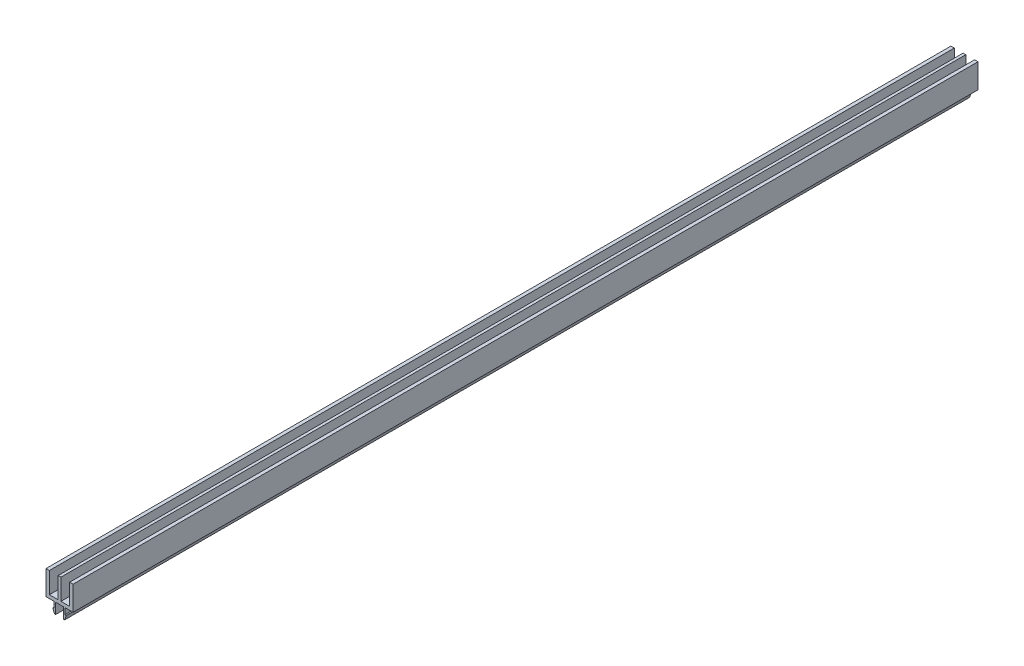
ISO-10303-21;
HEADER;
FILE_DESCRIPTION(('STEP AP214'),'2;1');
FILE_NAME('part.step','',(''),(''),'','','');
FILE_SCHEMA(('AUTOMOTIVE_DESIGN { 1 0 10303 214 1 1 1 1 }'));
ENDSEC;
DATA;
#1=APPLICATION_CONTEXT('core data for automotive mechanical design processes');
#2=APPLICATION_PROTOCOL_DEFINITION('international standard','automotive_design',2000,#1);
#3=PRODUCT_CONTEXT('',#1,'mechanical');
#4=PRODUCT('Part','Part','',(#3));
#5=PRODUCT_RELATED_PRODUCT_CATEGORY('part','',(#4));
#6=PRODUCT_DEFINITION_FORMATION('','',#4);
#7=PRODUCT_DEFINITION_CONTEXT('part definition',#1,'design');
#8=PRODUCT_DEFINITION('design','',#6,#7);
#9=PRODUCT_DEFINITION_SHAPE('','',#8);
#10=(LENGTH_UNIT() NAMED_UNIT(*) SI_UNIT(.MILLI.,.METRE.));
#11=(NAMED_UNIT(*) PLANE_ANGLE_UNIT() SI_UNIT($,.RADIAN.));
#12=(NAMED_UNIT(*) SI_UNIT($,.STERADIAN.) SOLID_ANGLE_UNIT());
#13=UNCERTAINTY_MEASURE_WITH_UNIT(LENGTH_MEASURE(1.E-05),#10,'distance_accuracy_value','');
#14=(GEOMETRIC_REPRESENTATION_CONTEXT(3) GLOBAL_UNCERTAINTY_ASSIGNED_CONTEXT((#13)) GLOBAL_UNIT_ASSIGNED_CONTEXT((#10,
#11,#12)) REPRESENTATION_CONTEXT('',''));
#15=CARTESIAN_POINT('',(0.,0.,0.));
#16=DIRECTION('',(0.,0.,1.));
#17=DIRECTION('',(1.,0.,0.));
#18=AXIS2_PLACEMENT_3D('',#15,#16,#17);
#19=CARTESIAN_POINT('',(-1.,17.9999999975,-618.));
#20=DIRECTION('',(-1.,0.,0.));
#21=DIRECTION('',(0.,-1.,0.));
#22=AXIS2_PLACEMENT_3D('',#19,#20,#21);
#23=PLANE('',#22);
#24=DIRECTION('',(0.,-1.,0.));
#25=VECTOR('',#24,1.);
#26=CARTESIAN_POINT('',(-1.,17.9999999975,50.));
#27=LINE('',#26,#25);
#28=CARTESIAN_POINT('',(-1.,17.9999999975,50.));
#29=VERTEX_POINT('',#28);
#30=CARTESIAN_POINT('',(-1.,2.4999999995,50.));
#31=VERTEX_POINT('',#30);
#32=EDGE_CURVE('E226',#29,#31,#27,.T.);
#33=ORIENTED_EDGE('',*,*,#32,.F.);
#34=DIRECTION('',(0.,0.,1.));
#35=VECTOR('',#34,1.);
#36=CARTESIAN_POINT('',(-1.,17.9999999975,-618.));
#37=LINE('',#36,#35);
#38=CARTESIAN_POINT('',(-1.,17.9999999975,-618.));
#39=VERTEX_POINT('',#38);
#40=EDGE_CURVE('E11',#39,#29,#37,.T.);
#41=ORIENTED_EDGE('',*,*,#40,.F.);
#42=DIRECTION('',(0.,-1.,0.));
#43=VECTOR('',#42,1.);
#44=CARTESIAN_POINT('',(-1.,17.9999999975,-618.));
#45=LINE('',#44,#43);
#46=CARTESIAN_POINT('',(-1.,2.4999999995,-618.));
#47=VERTEX_POINT('',#46);
#48=EDGE_CURVE('E294',#39,#47,#45,.T.);
#49=ORIENTED_EDGE('',*,*,#48,.T.);
#50=DIRECTION('',(0.,0.,1.));
#51=VECTOR('',#50,1.);
#52=CARTESIAN_POINT('',(-1.,2.4999999995,-618.));
#53=LINE('',#52,#51);
#54=EDGE_CURVE('E36',#47,#31,#53,.T.);
#55=ORIENTED_EDGE('',*,*,#54,.T.);
#56=EDGE_LOOP('',(#33,#41,#49,#55));
#57=FACE_BOUND('',#56,.T.);
#58=ADVANCED_FACE('F33',(#57),#23,.T.);
#59=CARTESIAN_POINT('',(0.999999999999998,17.9999999975,-618.));
#60=DIRECTION('',(0.,1.,0.));
#61=DIRECTION('',(0.,0.,1.));
#62=AXIS2_PLACEMENT_3D('',#59,#60,#61);
#63=PLANE('',#62);
#64=DIRECTION('',(-1.,0.,0.));
#65=VECTOR('',#64,1.);
#66=CARTESIAN_POINT('',(0.999999999999998,17.9999999975,50.));
#67=LINE('',#66,#65);
#68=CARTESIAN_POINT('',(0.999999999999998,17.9999999975,50.));
#69=VERTEX_POINT('',#68);
#70=EDGE_CURVE('E292',#69,#29,#67,.T.);
#71=ORIENTED_EDGE('',*,*,#70,.F.);
#72=DIRECTION('',(0.,0.,1.));
#73=VECTOR('',#72,1.);
#74=CARTESIAN_POINT('',(0.999999999999998,17.9999999975,-618.));
#75=LINE('',#74,#73);
#76=CARTESIAN_POINT('',(0.999999999999998,17.9999999975,-618.));
#77=VERTEX_POINT('',#76);
#78=EDGE_CURVE('E42',#77,#69,#75,.T.);
#79=ORIENTED_EDGE('',*,*,#78,.F.);
#80=DIRECTION('',(-1.,0.,0.));
#81=VECTOR('',#80,1.);
#82=CARTESIAN_POINT('',(0.999999999999998,17.9999999975,-618.));
#83=LINE('',#82,#81);
#84=EDGE_CURVE('E216',#77,#39,#83,.T.);
#85=ORIENTED_EDGE('',*,*,#84,.T.);
#86=ORIENTED_EDGE('',*,*,#40,.T.);
#87=EDGE_LOOP('',(#71,#79,#85,#86));
#88=FACE_BOUND('',#87,.T.);
#89=ADVANCED_FACE('F338',(#88),#63,.T.);
#90=CARTESIAN_POINT('',(0.999999999999998,2.4999999995,-618.));
#91=DIRECTION('',(1.,0.,0.));
#92=DIRECTION('',(0.,0.,-1.));
#93=AXIS2_PLACEMENT_3D('',#90,#91,#92);
#94=PLANE('',#93);
#95=DIRECTION('',(0.,1.,0.));
#96=VECTOR('',#95,1.);
#97=CARTESIAN_POINT('',(0.999999999999998,2.4999999995,50.));
#98=LINE('',#97,#96);
#99=CARTESIAN_POINT('',(0.999999999999998,2.4999999995,50.));
#100=VERTEX_POINT('',#99);
#101=EDGE_CURVE('E203',#100,#69,#98,.T.);
#102=ORIENTED_EDGE('',*,*,#101,.F.);
#103=DIRECTION('',(0.,0.,1.));
#104=VECTOR('',#103,1.);
#105=CARTESIAN_POINT('',(0.999999999999998,2.4999999995,-618.));
#106=LINE('',#105,#104);
#107=CARTESIAN_POINT('',(0.999999999999998,2.4999999995,-618.));
#108=VERTEX_POINT('',#107);
#109=EDGE_CURVE('E198',#108,#100,#106,.T.);
#110=ORIENTED_EDGE('',*,*,#109,.F.);
#111=DIRECTION('',(0.,1.,0.));
#112=VECTOR('',#111,1.);
#113=CARTESIAN_POINT('',(0.999999999999998,2.4999999995,-618.));
#114=LINE('',#113,#112);
#115=EDGE_CURVE('E201',#108,#77,#114,.T.);
#116=ORIENTED_EDGE('',*,*,#115,.T.);
#117=ORIENTED_EDGE('',*,*,#78,.T.);
#118=EDGE_LOOP('',(#102,#110,#116,#117));
#119=FACE_BOUND('',#118,.T.);
#120=ADVANCED_FACE('F200',(#119),#94,.T.);
#121=CARTESIAN_POINT('',(7.5,2.4999999995,-618.));
#122=DIRECTION('',(0.,1.,0.));
#123=DIRECTION('',(-1.,0.,0.));
#124=AXIS2_PLACEMENT_3D('',#121,#122,#123);
#125=PLANE('',#124);
#126=DIRECTION('',(-1.,0.,0.));
#127=VECTOR('',#126,1.);
#128=CARTESIAN_POINT('',(7.5,2.4999999995,50.));
#129=LINE('',#128,#127);
#130=CARTESIAN_POINT('',(7.5,2.4999999995,50.));
#131=VERTEX_POINT('',#130);
#132=EDGE_CURVE('E289',#131,#100,#129,.T.);
#133=ORIENTED_EDGE('',*,*,#132,.F.);
#134=DIRECTION('',(0.,0.,1.));
#135=VECTOR('',#134,1.);
#136=CARTESIAN_POINT('',(7.5,2.4999999995,-618.));
#137=LINE('',#136,#135);
#138=CARTESIAN_POINT('',(7.5,2.4999999995,-618.));
#139=VERTEX_POINT('',#138);
#140=EDGE_CURVE('E208',#139,#131,#137,.T.);
#141=ORIENTED_EDGE('',*,*,#140,.F.);
#142=DIRECTION('',(-1.,0.,0.));
#143=VECTOR('',#142,1.);
#144=CARTESIAN_POINT('',(7.5,2.4999999995,-618.));
#145=LINE('',#144,#143);
#146=EDGE_CURVE('E214',#139,#108,#145,.T.);
#147=ORIENTED_EDGE('',*,*,#146,.T.);
#148=ORIENTED_EDGE('',*,*,#109,.T.);
#149=EDGE_LOOP('',(#133,#141,#147,#148));
#150=FACE_BOUND('',#149,.T.);
#151=ADVANCED_FACE('F218',(#150),#125,.T.);
#152=CARTESIAN_POINT('',(7.5,17.9999999975,-618.));
#153=DIRECTION('',(-1.,0.,0.));
#154=DIRECTION('',(0.,-1.,0.));
#155=AXIS2_PLACEMENT_3D('',#152,#153,#154);
#156=PLANE('',#155);
#157=DIRECTION('',(0.,-1.,0.));
#158=VECTOR('',#157,1.);
#159=CARTESIAN_POINT('',(7.5,17.9999999975,50.));
#160=LINE('',#159,#158);
#161=CARTESIAN_POINT('',(7.5,17.9999999975,50.));
#162=VERTEX_POINT('',#161);
#163=EDGE_CURVE('E286',#162,#131,#160,.T.);
#164=ORIENTED_EDGE('',*,*,#163,.F.);
#165=DIRECTION('',(0.,0.,1.));
#166=VECTOR('',#165,1.);
#167=CARTESIAN_POINT('',(7.5,17.9999999975,-618.));
#168=LINE('',#167,#166);
#169=CARTESIAN_POINT('',(7.5,17.9999999975,-618.));
#170=VERTEX_POINT('',#169);
#171=EDGE_CURVE('E298',#170,#162,#168,.T.);
#172=ORIENTED_EDGE('',*,*,#171,.F.);
#173=DIRECTION('',(0.,-1.,0.));
#174=VECTOR('',#173,1.);
#175=CARTESIAN_POINT('',(7.5,17.9999999975,-618.));
#176=LINE('',#175,#174);
#177=EDGE_CURVE('E219',#170,#139,#176,.T.);
#178=ORIENTED_EDGE('',*,*,#177,.T.);
#179=ORIENTED_EDGE('',*,*,#140,.T.);
#180=EDGE_LOOP('',(#164,#172,#178,#179));
#181=FACE_BOUND('',#180,.T.);
#182=ADVANCED_FACE('F351',(#181),#156,.T.);
#183=CARTESIAN_POINT('',(10.,17.9999999975,-618.));
#184=DIRECTION('',(0.,1.,0.));
#185=DIRECTION('',(0.,0.,1.));
#186=AXIS2_PLACEMENT_3D('',#183,#184,#185);
#187=PLANE('',#186);
#188=DIRECTION('',(-1.,0.,0.));
#189=VECTOR('',#188,1.);
#190=CARTESIAN_POINT('',(10.,17.9999999975,50.));
#191=LINE('',#190,#189);
#192=CARTESIAN_POINT('',(10.,17.9999999975,50.));
#193=VERTEX_POINT('',#192);
#194=EDGE_CURVE('E283',#193,#162,#191,.T.);
#195=ORIENTED_EDGE('',*,*,#194,.F.);
#196=DIRECTION('',(0.,0.,1.));
#197=VECTOR('',#196,1.);
#198=CARTESIAN_POINT('',(10.,17.9999999975,-618.));
#199=LINE('',#198,#197);
#200=CARTESIAN_POINT('',(10.,17.9999999975,-618.));
#201=VERTEX_POINT('',#200);
#202=EDGE_CURVE('E300',#201,#193,#199,.T.);
#203=ORIENTED_EDGE('',*,*,#202,.F.);
#204=DIRECTION('',(-1.,0.,0.));
#205=VECTOR('',#204,1.);
#206=CARTESIAN_POINT('',(10.,17.9999999975,-618.));
#207=LINE('',#206,#205);
#208=EDGE_CURVE('E221',#201,#170,#207,.T.);
#209=ORIENTED_EDGE('',*,*,#208,.T.);
#210=ORIENTED_EDGE('',*,*,#171,.T.);
#211=EDGE_LOOP('',(#195,#203,#209,#210));
#212=FACE_BOUND('',#211,.T.);
#213=ADVANCED_FACE('F354',(#212),#187,.T.);
#214=CARTESIAN_POINT('',(10.,-4.99999828349541E-10,-618.));
#215=DIRECTION('',(1.,0.,0.));
#216=DIRECTION('',(0.,0.,-1.));
#217=AXIS2_PLACEMENT_3D('',#214,#215,#216);
#218=PLANE('',#217);
#219=DIRECTION('',(0.,1.,0.));
#220=VECTOR('',#219,1.);
#221=CARTESIAN_POINT('',(10.,-4.99999828349541E-10,50.));
#222=LINE('',#221,#220);
#223=CARTESIAN_POINT('',(10.,-4.99999828349541E-10,50.));
#224=VERTEX_POINT('',#223);
#225=EDGE_CURVE('E280',#224,#193,#222,.T.);
#226=ORIENTED_EDGE('',*,*,#225,.F.);
#227=DIRECTION('',(0.,0.,1.));
#228=VECTOR('',#227,1.);
#229=CARTESIAN_POINT('',(10.,-4.99999828349541E-10,-618.));
#230=LINE('',#229,#228);
#231=CARTESIAN_POINT('',(10.,-4.99999828349541E-10,-618.));
#232=VERTEX_POINT('',#231);
#233=EDGE_CURVE('E302',#232,#224,#230,.T.);
#234=ORIENTED_EDGE('',*,*,#233,.F.);
#235=DIRECTION('',(0.,1.,0.));
#236=VECTOR('',#235,1.);
#237=CARTESIAN_POINT('',(10.,-4.99999828349541E-10,-618.));
#238=LINE('',#237,#236);
#239=EDGE_CURVE('E644',#232,#201,#238,.T.);
#240=ORIENTED_EDGE('',*,*,#239,.T.);
#241=ORIENTED_EDGE('',*,*,#202,.T.);
#242=EDGE_LOOP('',(#226,#234,#240,#241));
#243=FACE_BOUND('',#242,.T.);
#244=ADVANCED_FACE('F358',(#243),#218,.T.);
#245=CARTESIAN_POINT('',(4.,-4.99999998002099E-10,-618.));
#246=DIRECTION('',(0.,-1.,0.));
#247=DIRECTION('',(1.,0.,0.));
#248=AXIS2_PLACEMENT_3D('',#245,#246,#247);
#249=PLANE('',#248);
#250=DIRECTION('',(1.,0.,0.));
#251=VECTOR('',#250,1.);
#252=CARTESIAN_POINT('',(4.,-4.99999998002099E-10,50.));
#253=LINE('',#252,#251);
#254=CARTESIAN_POINT('',(4.,-4.99999998002099E-10,50.));
#255=VERTEX_POINT('',#254);
#256=EDGE_CURVE('E277',#255,#224,#253,.T.);
#257=ORIENTED_EDGE('',*,*,#256,.F.);
#258=DIRECTION('',(0.,0.,1.));
#259=VECTOR('',#258,1.);
#260=CARTESIAN_POINT('',(4.,-4.99999998002099E-10,-618.));
#261=LINE('',#260,#259);
#262=CARTESIAN_POINT('',(4.,-4.99999998002099E-10,-618.));
#263=VERTEX_POINT('',#262);
#264=EDGE_CURVE('E304',#263,#255,#261,.T.);
#265=ORIENTED_EDGE('',*,*,#264,.F.);
#266=DIRECTION('',(1.,0.,0.));
#267=VECTOR('',#266,1.);
#268=CARTESIAN_POINT('',(4.,-4.99999998002099E-10,-618.));
#269=LINE('',#268,#267);
#270=EDGE_CURVE('E648',#263,#232,#269,.T.);
#271=ORIENTED_EDGE('',*,*,#270,.T.);
#272=ORIENTED_EDGE('',*,*,#233,.T.);
#273=EDGE_LOOP('',(#257,#265,#271,#272));
#274=FACE_BOUND('',#273,.T.);
#275=ADVANCED_FACE('F362',(#274),#249,.T.);
#276=CARTESIAN_POINT('',(4.,-4.5,-618.));
#277=DIRECTION('',(1.,0.,0.));
#278=DIRECTION('',(0.,0.,-1.));
#279=AXIS2_PLACEMENT_3D('',#276,#277,#278);
#280=PLANE('',#279);
#281=DIRECTION('',(0.,1.,0.));
#282=VECTOR('',#281,1.);
#283=CARTESIAN_POINT('',(4.,-4.5,50.));
#284=LINE('',#283,#282);
#285=CARTESIAN_POINT('',(4.,-4.5,50.));
#286=VERTEX_POINT('',#285);
#287=EDGE_CURVE('E274',#286,#255,#284,.T.);
#288=ORIENTED_EDGE('',*,*,#287,.F.);
#289=DIRECTION('',(0.,0.,1.));
#290=VECTOR('',#289,1.);
#291=CARTESIAN_POINT('',(4.,-4.5,-618.));
#292=LINE('',#291,#290);
#293=CARTESIAN_POINT('',(4.,-4.5,-618.));
#294=VERTEX_POINT('',#293);
#295=EDGE_CURVE('E306',#294,#286,#292,.T.);
#296=ORIENTED_EDGE('',*,*,#295,.F.);
#297=DIRECTION('',(0.,1.,0.));
#298=VECTOR('',#297,1.);
#299=CARTESIAN_POINT('',(4.,-4.5,-618.));
#300=LINE('',#299,#298);
#301=EDGE_CURVE('E637',#294,#263,#300,.T.);
#302=ORIENTED_EDGE('',*,*,#301,.T.);
#303=ORIENTED_EDGE('',*,*,#264,.T.);
#304=EDGE_LOOP('',(#288,#296,#302,#303));
#305=FACE_BOUND('',#304,.T.);
#306=ADVANCED_FACE('F366',(#305),#280,.T.);
#307=CARTESIAN_POINT('',(5.,-4.5,-618.));
#308=DIRECTION('',(0.,1.,0.));
#309=DIRECTION('',(0.,0.,1.));
#310=AXIS2_PLACEMENT_3D('',#307,#308,#309);
#311=PLANE('',#310);
#312=DIRECTION('',(-1.,0.,0.));
#313=VECTOR('',#312,1.);
#314=CARTESIAN_POINT('',(5.,-4.5,50.));
#315=LINE('',#314,#313);
#316=CARTESIAN_POINT('',(5.,-4.5,50.));
#317=VERTEX_POINT('',#316);
#318=EDGE_CURVE('E271',#317,#286,#315,.T.);
#319=ORIENTED_EDGE('',*,*,#318,.F.);
#320=DIRECTION('',(0.,0.,1.));
#321=VECTOR('',#320,1.);
#322=CARTESIAN_POINT('',(5.,-4.5,-618.));
#323=LINE('',#322,#321);
#324=CARTESIAN_POINT('',(5.,-4.5,-618.));
#325=VERTEX_POINT('',#324);
#326=EDGE_CURVE('E308',#325,#317,#323,.T.);
#327=ORIENTED_EDGE('',*,*,#326,.F.);
#328=DIRECTION('',(-1.,0.,0.));
#329=VECTOR('',#328,1.);
#330=CARTESIAN_POINT('',(5.,-4.5,-618.));
#331=LINE('',#330,#329);
#332=EDGE_CURVE('E633',#325,#294,#331,.T.);
#333=ORIENTED_EDGE('',*,*,#332,.T.);
#334=ORIENTED_EDGE('',*,*,#295,.T.);
#335=EDGE_LOOP('',(#319,#327,#333,#334));
#336=FACE_BOUND('',#335,.T.);
#337=ADVANCED_FACE('F370',(#336),#311,.T.);
#338=CARTESIAN_POINT('',(3.75,-8.,-618.));
#339=DIRECTION('',(0.941741911594837,-0.336336396998157,0.));
#340=DIRECTION('',(0.336336396998157,0.941741911594837,0.));
#341=AXIS2_PLACEMENT_3D('',#338,#339,#340);
#342=PLANE('',#341);
#343=DIRECTION('',(0.336336396998157,0.941741911594837,0.));
#344=VECTOR('',#343,1.);
#345=CARTESIAN_POINT('',(3.75,-8.,50.));
#346=LINE('',#345,#344);
#347=CARTESIAN_POINT('',(3.75,-8.,50.));
#348=VERTEX_POINT('',#347);
#349=EDGE_CURVE('E268',#348,#317,#346,.T.);
#350=ORIENTED_EDGE('',*,*,#349,.F.);
#351=DIRECTION('',(0.,0.,1.));
#352=VECTOR('',#351,1.);
#353=CARTESIAN_POINT('',(3.75,-8.,-618.));
#354=LINE('',#353,#352);
#355=CARTESIAN_POINT('',(3.75,-8.,-618.));
#356=VERTEX_POINT('',#355);
#357=EDGE_CURVE('E310',#356,#348,#354,.T.);
#358=ORIENTED_EDGE('',*,*,#357,.F.);
#359=DIRECTION('',(0.336336396998157,0.941741911594837,0.));
#360=VECTOR('',#359,1.);
#361=CARTESIAN_POINT('',(3.75,-8.,-618.));
#362=LINE('',#361,#360);
#363=EDGE_CURVE('E654',#356,#325,#362,.T.);
#364=ORIENTED_EDGE('',*,*,#363,.T.);
#365=ORIENTED_EDGE('',*,*,#326,.T.);
#366=EDGE_LOOP('',(#350,#358,#364,#365));
#367=FACE_BOUND('',#366,.T.);
#368=ADVANCED_FACE('F374',(#367),#342,.T.);
#369=CARTESIAN_POINT('',(3.,-8.,-618.));
#370=DIRECTION('',(0.,-1.,0.));
#371=DIRECTION('',(0.,0.,-1.));
#372=AXIS2_PLACEMENT_3D('',#369,#370,#371);
#373=PLANE('',#372);
#374=DIRECTION('',(1.,0.,0.));
#375=VECTOR('',#374,1.);
#376=CARTESIAN_POINT('',(3.,-8.,50.));
#377=LINE('',#376,#375);
#378=CARTESIAN_POINT('',(3.,-8.,50.));
#379=VERTEX_POINT('',#378);
#380=EDGE_CURVE('E265',#379,#348,#377,.T.);
#381=ORIENTED_EDGE('',*,*,#380,.F.);
#382=DIRECTION('',(0.,0.,1.));
#383=VECTOR('',#382,1.);
#384=CARTESIAN_POINT('',(3.,-8.,-618.));
#385=LINE('',#384,#383);
#386=CARTESIAN_POINT('',(3.,-8.,-618.));
#387=VERTEX_POINT('',#386);
#388=EDGE_CURVE('E312',#387,#379,#385,.T.);
#389=ORIENTED_EDGE('',*,*,#388,.F.);
#390=DIRECTION('',(1.,0.,0.));
#391=VECTOR('',#390,1.);
#392=CARTESIAN_POINT('',(3.,-8.,-618.));
#393=LINE('',#392,#391);
#394=EDGE_CURVE('E626',#387,#356,#393,.T.);
#395=ORIENTED_EDGE('',*,*,#394,.T.);
#396=ORIENTED_EDGE('',*,*,#357,.T.);
#397=EDGE_LOOP('',(#381,#389,#395,#396));
#398=FACE_BOUND('',#397,.T.);
#399=ADVANCED_FACE('F378',(#398),#373,.T.);
#400=CARTESIAN_POINT('',(3.,-4.9999985194348E-10,-618.));
#401=DIRECTION('',(-1.,0.,0.));
#402=DIRECTION('',(0.,0.,1.));
#403=AXIS2_PLACEMENT_3D('',#400,#401,#402);
#404=PLANE('',#403);
#405=DIRECTION('',(0.,-1.,0.));
#406=VECTOR('',#405,1.);
#407=CARTESIAN_POINT('',(3.,-4.9999985194348E-10,50.));
#408=LINE('',#407,#406);
#409=CARTESIAN_POINT('',(3.,-4.9999985194348E-10,50.));
#410=VERTEX_POINT('',#409);
#411=EDGE_CURVE('E262',#410,#379,#408,.T.);
#412=ORIENTED_EDGE('',*,*,#411,.F.);
#413=DIRECTION('',(0.,0.,1.));
#414=VECTOR('',#413,1.);
#415=CARTESIAN_POINT('',(3.,-4.9999985194348E-10,-618.));
#416=LINE('',#415,#414);
#417=CARTESIAN_POINT('',(3.,-4.9999985194348E-10,-618.));
#418=VERTEX_POINT('',#417);
#419=EDGE_CURVE('E314',#418,#410,#416,.T.);
#420=ORIENTED_EDGE('',*,*,#419,.F.);
#421=DIRECTION('',(0.,-1.,0.));
#422=VECTOR('',#421,1.);
#423=CARTESIAN_POINT('',(3.,-4.9999985194348E-10,-618.));
#424=LINE('',#423,#422);
#425=EDGE_CURVE('E622',#418,#387,#424,.T.);
#426=ORIENTED_EDGE('',*,*,#425,.T.);
#427=ORIENTED_EDGE('',*,*,#388,.T.);
#428=EDGE_LOOP('',(#412,#420,#426,#427));
#429=FACE_BOUND('',#428,.T.);
#430=ADVANCED_FACE('F382',(#429),#404,.T.);
#431=CARTESIAN_POINT('',(-3.,-4.99999455901012E-10,-618.));
#432=DIRECTION('',(0.,-1.,0.));
#433=DIRECTION('',(1.,0.,0.));
#434=AXIS2_PLACEMENT_3D('',#431,#432,#433);
#435=PLANE('',#434);
#436=DIRECTION('',(1.,0.,0.));
#437=VECTOR('',#436,1.);
#438=CARTESIAN_POINT('',(-3.,-4.99999455901012E-10,50.));
#439=LINE('',#438,#437);
#440=CARTESIAN_POINT('',(-3.,-4.99999455901012E-10,50.));
#441=VERTEX_POINT('',#440);
#442=EDGE_CURVE('E259',#441,#410,#439,.T.);
#443=ORIENTED_EDGE('',*,*,#442,.F.);
#444=DIRECTION('',(0.,0.,1.));
#445=VECTOR('',#444,1.);
#446=CARTESIAN_POINT('',(-3.,-4.99999455901012E-10,-618.));
#447=LINE('',#446,#445);
#448=CARTESIAN_POINT('',(-3.,-4.99999455901012E-10,-618.));
#449=VERTEX_POINT('',#448);
#450=EDGE_CURVE('E316',#449,#441,#447,.T.);
#451=ORIENTED_EDGE('',*,*,#450,.F.);
#452=DIRECTION('',(1.,0.,0.));
#453=VECTOR('',#452,1.);
#454=CARTESIAN_POINT('',(-3.,-4.99999455901012E-10,-618.));
#455=LINE('',#454,#453);
#456=EDGE_CURVE('E658',#449,#418,#455,.T.);
#457=ORIENTED_EDGE('',*,*,#456,.T.);
#458=ORIENTED_EDGE('',*,*,#419,.T.);
#459=EDGE_LOOP('',(#443,#451,#457,#458));
#460=FACE_BOUND('',#459,.T.);
#461=ADVANCED_FACE('F386',(#460),#435,.T.);
#462=CARTESIAN_POINT('',(-3.,-8.,-618.));
#463=DIRECTION('',(1.,0.,0.));
#464=DIRECTION('',(0.,0.,-1.));
#465=AXIS2_PLACEMENT_3D('',#462,#463,#464);
#466=PLANE('',#465);
#467=DIRECTION('',(0.,1.,0.));
#468=VECTOR('',#467,1.);
#469=CARTESIAN_POINT('',(-3.,-8.,50.));
#470=LINE('',#469,#468);
#471=CARTESIAN_POINT('',(-3.,-8.,50.));
#472=VERTEX_POINT('',#471);
#473=EDGE_CURVE('E256',#472,#441,#470,.T.);
#474=ORIENTED_EDGE('',*,*,#473,.F.);
#475=DIRECTION('',(0.,0.,1.));
#476=VECTOR('',#475,1.);
#477=CARTESIAN_POINT('',(-3.,-8.,-618.));
#478=LINE('',#477,#476);
#479=CARTESIAN_POINT('',(-3.,-8.,-618.));
#480=VERTEX_POINT('',#479);
#481=EDGE_CURVE('E318',#480,#472,#478,.T.);
#482=ORIENTED_EDGE('',*,*,#481,.F.);
#483=DIRECTION('',(0.,1.,0.));
#484=VECTOR('',#483,1.);
#485=CARTESIAN_POINT('',(-3.,-8.,-618.));
#486=LINE('',#485,#484);
#487=EDGE_CURVE('E615',#480,#449,#486,.T.);
#488=ORIENTED_EDGE('',*,*,#487,.T.);
#489=ORIENTED_EDGE('',*,*,#450,.T.);
#490=EDGE_LOOP('',(#474,#482,#488,#489));
#491=FACE_BOUND('',#490,.T.);
#492=ADVANCED_FACE('F390',(#491),#466,.T.);
#493=CARTESIAN_POINT('',(-3.75,-8.,-618.));
#494=DIRECTION('',(0.,-1.,0.));
#495=DIRECTION('',(0.,0.,-1.));
#496=AXIS2_PLACEMENT_3D('',#493,#494,#495);
#497=PLANE('',#496);
#498=DIRECTION('',(1.,0.,0.));
#499=VECTOR('',#498,1.);
#500=CARTESIAN_POINT('',(-3.75,-8.,50.));
#501=LINE('',#500,#499);
#502=CARTESIAN_POINT('',(-3.75,-8.,50.));
#503=VERTEX_POINT('',#502);
#504=EDGE_CURVE('E253',#503,#472,#501,.T.);
#505=ORIENTED_EDGE('',*,*,#504,.F.);
#506=DIRECTION('',(0.,0.,1.));
#507=VECTOR('',#506,1.);
#508=CARTESIAN_POINT('',(-3.75,-8.,-618.));
#509=LINE('',#508,#507);
#510=CARTESIAN_POINT('',(-3.75,-8.,-618.));
#511=VERTEX_POINT('',#510);
#512=EDGE_CURVE('E320',#511,#503,#509,.T.);
#513=ORIENTED_EDGE('',*,*,#512,.F.);
#514=DIRECTION('',(1.,0.,0.));
#515=VECTOR('',#514,1.);
#516=CARTESIAN_POINT('',(-3.75,-8.,-618.));
#517=LINE('',#516,#515);
#518=EDGE_CURVE('E611',#511,#480,#517,.T.);
#519=ORIENTED_EDGE('',*,*,#518,.T.);
#520=ORIENTED_EDGE('',*,*,#481,.T.);
#521=EDGE_LOOP('',(#505,#513,#519,#520));
#522=FACE_BOUND('',#521,.T.);
#523=ADVANCED_FACE('F394',(#522),#497,.T.);
#524=CARTESIAN_POINT('',(-5.,-4.5,-618.));
#525=DIRECTION('',(-0.941741911594837,-0.336336396998156,0.));
#526=DIRECTION('',(0.336336396998156,-0.941741911594837,0.));
#527=AXIS2_PLACEMENT_3D('',#524,#525,#526);
#528=PLANE('',#527);
#529=DIRECTION('',(0.336336396998156,-0.941741911594837,0.));
#530=VECTOR('',#529,1.);
#531=CARTESIAN_POINT('',(-5.,-4.5,50.));
#532=LINE('',#531,#530);
#533=CARTESIAN_POINT('',(-5.,-4.5,50.));
#534=VERTEX_POINT('',#533);
#535=EDGE_CURVE('E250',#534,#503,#532,.T.);
#536=ORIENTED_EDGE('',*,*,#535,.F.);
#537=DIRECTION('',(0.,0.,1.));
#538=VECTOR('',#537,1.);
#539=CARTESIAN_POINT('',(-5.,-4.5,-618.));
#540=LINE('',#539,#538);
#541=CARTESIAN_POINT('',(-5.,-4.5,-618.));
#542=VERTEX_POINT('',#541);
#543=EDGE_CURVE('E322',#542,#534,#540,.T.);
#544=ORIENTED_EDGE('',*,*,#543,.F.);
#545=DIRECTION('',(0.336336396998156,-0.941741911594837,0.));
#546=VECTOR('',#545,1.);
#547=CARTESIAN_POINT('',(-5.,-4.5,-618.));
#548=LINE('',#547,#546);
#549=EDGE_CURVE('E662',#542,#511,#548,.T.);
#550=ORIENTED_EDGE('',*,*,#549,.T.);
#551=ORIENTED_EDGE('',*,*,#512,.T.);
#552=EDGE_LOOP('',(#536,#544,#550,#551));
#553=FACE_BOUND('',#552,.T.);
#554=ADVANCED_FACE('F398',(#553),#528,.T.);
#555=CARTESIAN_POINT('',(-4.,-4.5,-618.));
#556=DIRECTION('',(0.,1.,0.));
#557=DIRECTION('',(0.,0.,1.));
#558=AXIS2_PLACEMENT_3D('',#555,#556,#557);
#559=PLANE('',#558);
#560=DIRECTION('',(-1.,0.,0.));
#561=VECTOR('',#560,1.);
#562=CARTESIAN_POINT('',(-4.,-4.5,50.));
#563=LINE('',#562,#561);
#564=CARTESIAN_POINT('',(-4.,-4.5,50.));
#565=VERTEX_POINT('',#564);
#566=EDGE_CURVE('E247',#565,#534,#563,.T.);
#567=ORIENTED_EDGE('',*,*,#566,.F.);
#568=DIRECTION('',(0.,0.,1.));
#569=VECTOR('',#568,1.);
#570=CARTESIAN_POINT('',(-4.,-4.5,-618.));
#571=LINE('',#570,#569);
#572=CARTESIAN_POINT('',(-4.,-4.5,-618.));
#573=VERTEX_POINT('',#572);
#574=EDGE_CURVE('E324',#573,#565,#571,.T.);
#575=ORIENTED_EDGE('',*,*,#574,.F.);
#576=DIRECTION('',(-1.,0.,0.));
#577=VECTOR('',#576,1.);
#578=CARTESIAN_POINT('',(-4.,-4.5,-618.));
#579=LINE('',#578,#577);
#580=EDGE_CURVE('E604',#573,#542,#579,.T.);
#581=ORIENTED_EDGE('',*,*,#580,.T.);
#582=ORIENTED_EDGE('',*,*,#543,.T.);
#583=EDGE_LOOP('',(#567,#575,#581,#582));
#584=FACE_BOUND('',#583,.T.);
#585=ADVANCED_FACE('F402',(#584),#559,.T.);
#586=CARTESIAN_POINT('',(-4.,-4.9999985194348E-10,-618.));
#587=DIRECTION('',(-1.,0.,0.));
#588=DIRECTION('',(0.,0.,1.));
#589=AXIS2_PLACEMENT_3D('',#586,#587,#588);
#590=PLANE('',#589);
#591=DIRECTION('',(0.,-1.,0.));
#592=VECTOR('',#591,1.);
#593=CARTESIAN_POINT('',(-4.,-4.9999985194348E-10,50.));
#594=LINE('',#593,#592);
#595=CARTESIAN_POINT('',(-4.,-4.9999985194348E-10,50.));
#596=VERTEX_POINT('',#595);
#597=EDGE_CURVE('E244',#596,#565,#594,.T.);
#598=ORIENTED_EDGE('',*,*,#597,.F.);
#599=DIRECTION('',(0.,0.,1.));
#600=VECTOR('',#599,1.);
#601=CARTESIAN_POINT('',(-4.,-4.9999985194348E-10,-618.));
#602=LINE('',#601,#600);
#603=CARTESIAN_POINT('',(-4.,-4.9999985194348E-10,-618.));
#604=VERTEX_POINT('',#603);
#605=EDGE_CURVE('E326',#604,#596,#602,.T.);
#606=ORIENTED_EDGE('',*,*,#605,.F.);
#607=DIRECTION('',(0.,-1.,0.));
#608=VECTOR('',#607,1.);
#609=CARTESIAN_POINT('',(-4.,-4.9999985194348E-10,-618.));
#610=LINE('',#609,#608);
#611=EDGE_CURVE('E600',#604,#573,#610,.T.);
#612=ORIENTED_EDGE('',*,*,#611,.T.);
#613=ORIENTED_EDGE('',*,*,#574,.T.);
#614=EDGE_LOOP('',(#598,#606,#612,#613));
#615=FACE_BOUND('',#614,.T.);
#616=ADVANCED_FACE('F406',(#615),#590,.T.);
#617=CARTESIAN_POINT('',(-10.,-4.99999719929324E-10,-618.));
#618=DIRECTION('',(0.,-1.,0.));
#619=DIRECTION('',(1.,0.,0.));
#620=AXIS2_PLACEMENT_3D('',#617,#618,#619);
#621=PLANE('',#620);
#622=DIRECTION('',(1.,0.,0.));
#623=VECTOR('',#622,1.);
#624=CARTESIAN_POINT('',(-10.,-4.99999719929324E-10,50.));
#625=LINE('',#624,#623);
#626=CARTESIAN_POINT('',(-10.,-4.99999719929324E-10,50.));
#627=VERTEX_POINT('',#626);
#628=EDGE_CURVE('E241',#627,#596,#625,.T.);
#629=ORIENTED_EDGE('',*,*,#628,.F.);
#630=DIRECTION('',(0.,0.,1.));
#631=VECTOR('',#630,1.);
#632=CARTESIAN_POINT('',(-10.,-4.99999719929324E-10,-618.));
#633=LINE('',#632,#631);
#634=CARTESIAN_POINT('',(-10.,-4.99999719929324E-10,-618.));
#635=VERTEX_POINT('',#634);
#636=EDGE_CURVE('E328',#635,#627,#633,.T.);
#637=ORIENTED_EDGE('',*,*,#636,.F.);
#638=DIRECTION('',(1.,0.,0.));
#639=VECTOR('',#638,1.);
#640=CARTESIAN_POINT('',(-10.,-4.99999719929324E-10,-618.));
#641=LINE('',#640,#639);
#642=EDGE_CURVE('E666',#635,#604,#641,.T.);
#643=ORIENTED_EDGE('',*,*,#642,.T.);
#644=ORIENTED_EDGE('',*,*,#605,.T.);
#645=EDGE_LOOP('',(#629,#637,#643,#644));
#646=FACE_BOUND('',#645,.T.);
#647=ADVANCED_FACE('F410',(#646),#621,.T.);
#648=CARTESIAN_POINT('',(-10.,17.9999999975,-618.));
#649=DIRECTION('',(-1.,0.,0.));
#650=DIRECTION('',(0.,-1.,0.));
#651=AXIS2_PLACEMENT_3D('',#648,#649,#650);
#652=PLANE('',#651);
#653=DIRECTION('',(0.,-1.,0.));
#654=VECTOR('',#653,1.);
#655=CARTESIAN_POINT('',(-10.,17.9999999975,50.));
#656=LINE('',#655,#654);
#657=CARTESIAN_POINT('',(-10.,17.9999999975,50.));
#658=VERTEX_POINT('',#657);
#659=EDGE_CURVE('E238',#658,#627,#656,.T.);
#660=ORIENTED_EDGE('',*,*,#659,.F.);
#661=DIRECTION('',(0.,0.,1.));
#662=VECTOR('',#661,1.);
#663=CARTESIAN_POINT('',(-10.,17.9999999975,-618.));
#664=LINE('',#663,#662);
#665=CARTESIAN_POINT('',(-10.,17.9999999975,-618.));
#666=VERTEX_POINT('',#665);
#667=EDGE_CURVE('E330',#666,#658,#664,.T.);
#668=ORIENTED_EDGE('',*,*,#667,.F.);
#669=DIRECTION('',(0.,-1.,0.));
#670=VECTOR('',#669,1.);
#671=CARTESIAN_POINT('',(-10.,17.9999999975,-618.));
#672=LINE('',#671,#670);
#673=EDGE_CURVE('E593',#666,#635,#672,.T.);
#674=ORIENTED_EDGE('',*,*,#673,.T.);
#675=ORIENTED_EDGE('',*,*,#636,.T.);
#676=EDGE_LOOP('',(#660,#668,#674,#675));
#677=FACE_BOUND('',#676,.T.);
#678=ADVANCED_FACE('F414',(#677),#652,.T.);
#679=CARTESIAN_POINT('',(-7.5,17.9999999975,-618.));
#680=DIRECTION('',(0.,1.,0.));
#681=DIRECTION('',(0.,0.,1.));
#682=AXIS2_PLACEMENT_3D('',#679,#680,#681);
#683=PLANE('',#682);
#684=DIRECTION('',(-1.,0.,0.));
#685=VECTOR('',#684,1.);
#686=CARTESIAN_POINT('',(-7.5,17.9999999975,50.));
#687=LINE('',#686,#685);
#688=CARTESIAN_POINT('',(-7.5,17.9999999975,50.));
#689=VERTEX_POINT('',#688);
#690=EDGE_CURVE('E235',#689,#658,#687,.T.);
#691=ORIENTED_EDGE('',*,*,#690,.F.);
#692=DIRECTION('',(0.,0.,1.));
#693=VECTOR('',#692,1.);
#694=CARTESIAN_POINT('',(-7.5,17.9999999975,-618.));
#695=LINE('',#694,#693);
#696=CARTESIAN_POINT('',(-7.5,17.9999999975,-618.));
#697=VERTEX_POINT('',#696);
#698=EDGE_CURVE('E332',#697,#689,#695,.T.);
#699=ORIENTED_EDGE('',*,*,#698,.F.);
#700=DIRECTION('',(-1.,0.,0.));
#701=VECTOR('',#700,1.);
#702=CARTESIAN_POINT('',(-7.5,17.9999999975,-618.));
#703=LINE('',#702,#701);
#704=EDGE_CURVE('E589',#697,#666,#703,.T.);
#705=ORIENTED_EDGE('',*,*,#704,.T.);
#706=ORIENTED_EDGE('',*,*,#667,.T.);
#707=EDGE_LOOP('',(#691,#699,#705,#706));
#708=FACE_BOUND('',#707,.T.);
#709=ADVANCED_FACE('F418',(#708),#683,.T.);
#710=CARTESIAN_POINT('',(-7.5,2.4999999995,-618.));
#711=DIRECTION('',(1.,0.,0.));
#712=DIRECTION('',(0.,0.,-1.));
#713=AXIS2_PLACEMENT_3D('',#710,#711,#712);
#714=PLANE('',#713);
#715=DIRECTION('',(0.,1.,0.));
#716=VECTOR('',#715,1.);
#717=CARTESIAN_POINT('',(-7.5,2.4999999995,50.));
#718=LINE('',#717,#716);
#719=CARTESIAN_POINT('',(-7.5,2.4999999995,50.));
#720=VERTEX_POINT('',#719);
#721=EDGE_CURVE('E232',#720,#689,#718,.T.);
#722=ORIENTED_EDGE('',*,*,#721,.F.);
#723=DIRECTION('',(0.,0.,1.));
#724=VECTOR('',#723,1.);
#725=CARTESIAN_POINT('',(-7.5,2.4999999995,-618.));
#726=LINE('',#725,#724);
#727=CARTESIAN_POINT('',(-7.5,2.4999999995,-618.));
#728=VERTEX_POINT('',#727);
#729=EDGE_CURVE('E333',#728,#720,#726,.T.);
#730=ORIENTED_EDGE('',*,*,#729,.F.);
#731=DIRECTION('',(0.,1.,0.));
#732=VECTOR('',#731,1.);
#733=CARTESIAN_POINT('',(-7.5,2.4999999995,-618.));
#734=LINE('',#733,#732);
#735=EDGE_CURVE('E670',#728,#697,#734,.T.);
#736=ORIENTED_EDGE('',*,*,#735,.T.);
#737=ORIENTED_EDGE('',*,*,#698,.T.);
#738=EDGE_LOOP('',(#722,#730,#736,#737));
#739=FACE_BOUND('',#738,.T.);
#740=ADVANCED_FACE('F422',(#739),#714,.T.);
#741=CARTESIAN_POINT('',(-1.,2.4999999995,-618.));
#742=DIRECTION('',(0.,1.,0.));
#743=DIRECTION('',(-1.,0.,0.));
#744=AXIS2_PLACEMENT_3D('',#741,#742,#743);
#745=PLANE('',#744);
#746=DIRECTION('',(-1.,0.,0.));
#747=VECTOR('',#746,1.);
#748=CARTESIAN_POINT('',(-1.,2.4999999995,50.));
#749=LINE('',#748,#747);
#750=EDGE_CURVE('E229',#31,#720,#749,.T.);
#751=ORIENTED_EDGE('',*,*,#750,.F.);
#752=ORIENTED_EDGE('',*,*,#54,.F.);
#753=DIRECTION('',(-1.,0.,0.));
#754=VECTOR('',#753,1.);
#755=CARTESIAN_POINT('',(-1.,2.4999999995,-618.));
#756=LINE('',#755,#754);
#757=EDGE_CURVE('E672',#47,#728,#756,.T.);
#758=ORIENTED_EDGE('',*,*,#757,.T.);
#759=ORIENTED_EDGE('',*,*,#729,.T.);
#760=EDGE_LOOP('',(#751,#752,#758,#759));
#761=FACE_BOUND('',#760,.T.);
#762=ADVANCED_FACE('F335',(#761),#745,.T.);
#763=CARTESIAN_POINT('',(0.,0.,-618.));
#764=DIRECTION('',(0.,0.,-1.));
#765=DIRECTION('',(-1.,0.,0.));
#766=AXIS2_PLACEMENT_3D('',#763,#764,#765);
#767=PLANE('',#766);
#768=ORIENTED_EDGE('',*,*,#48,.F.);
#769=ORIENTED_EDGE('',*,*,#84,.F.);
#770=ORIENTED_EDGE('',*,*,#115,.F.);
#771=ORIENTED_EDGE('',*,*,#146,.F.);
#772=ORIENTED_EDGE('',*,*,#177,.F.);
#773=ORIENTED_EDGE('',*,*,#208,.F.);
#774=ORIENTED_EDGE('',*,*,#239,.F.);
#775=ORIENTED_EDGE('',*,*,#270,.F.);
#776=ORIENTED_EDGE('',*,*,#301,.F.);
#777=ORIENTED_EDGE('',*,*,#332,.F.);
#778=ORIENTED_EDGE('',*,*,#363,.F.);
#779=ORIENTED_EDGE('',*,*,#394,.F.);
#780=ORIENTED_EDGE('',*,*,#425,.F.);
#781=ORIENTED_EDGE('',*,*,#456,.F.);
#782=ORIENTED_EDGE('',*,*,#487,.F.);
#783=ORIENTED_EDGE('',*,*,#518,.F.);
#784=ORIENTED_EDGE('',*,*,#549,.F.);
#785=ORIENTED_EDGE('',*,*,#580,.F.);
#786=ORIENTED_EDGE('',*,*,#611,.F.);
#787=ORIENTED_EDGE('',*,*,#642,.F.);
#788=ORIENTED_EDGE('',*,*,#673,.F.);
#789=ORIENTED_EDGE('',*,*,#704,.F.);
#790=ORIENTED_EDGE('',*,*,#735,.F.);
#791=ORIENTED_EDGE('',*,*,#757,.F.);
#792=EDGE_LOOP('',(#768,#769,#770,#771,#772,#773,#774,#775,#776,#777,#778,#779,#780,#781,#782,
#783,#784,#785,#786,#787,#788,#789,#790,#791));
#793=FACE_BOUND('',#792,.T.);
#794=ADVANCED_FACE('F212',(#793),#767,.T.);
#795=CARTESIAN_POINT('',(0.,0.,50.));
#796=DIRECTION('',(0.,0.,-1.));
#797=DIRECTION('',(-1.,0.,0.));
#798=AXIS2_PLACEMENT_3D('',#795,#796,#797);
#799=PLANE('',#798);
#800=ORIENTED_EDGE('',*,*,#32,.T.);
#801=ORIENTED_EDGE('',*,*,#750,.T.);
#802=ORIENTED_EDGE('',*,*,#721,.T.);
#803=ORIENTED_EDGE('',*,*,#690,.T.);
#804=ORIENTED_EDGE('',*,*,#659,.T.);
#805=ORIENTED_EDGE('',*,*,#628,.T.);
#806=ORIENTED_EDGE('',*,*,#597,.T.);
#807=ORIENTED_EDGE('',*,*,#566,.T.);
#808=ORIENTED_EDGE('',*,*,#535,.T.);
#809=ORIENTED_EDGE('',*,*,#504,.T.);
#810=ORIENTED_EDGE('',*,*,#473,.T.);
#811=ORIENTED_EDGE('',*,*,#442,.T.);
#812=ORIENTED_EDGE('',*,*,#411,.T.);
#813=ORIENTED_EDGE('',*,*,#380,.T.);
#814=ORIENTED_EDGE('',*,*,#349,.T.);
#815=ORIENTED_EDGE('',*,*,#318,.T.);
#816=ORIENTED_EDGE('',*,*,#287,.T.);
#817=ORIENTED_EDGE('',*,*,#256,.T.);
#818=ORIENTED_EDGE('',*,*,#225,.T.);
#819=ORIENTED_EDGE('',*,*,#194,.T.);
#820=ORIENTED_EDGE('',*,*,#163,.T.);
#821=ORIENTED_EDGE('',*,*,#132,.T.);
#822=ORIENTED_EDGE('',*,*,#101,.T.);
#823=ORIENTED_EDGE('',*,*,#70,.T.);
#824=EDGE_LOOP('',(#800,#801,#802,#803,#804,#805,#806,#807,#808,#809,#810,#811,#812,#813,#814,
#815,#816,#817,#818,#819,#820,#821,#822,#823));
#825=FACE_BOUND('',#824,.T.);
#826=ADVANCED_FACE('F337',(#825),#799,.F.);
#827=CLOSED_SHELL('',(#58,#89,#120,#151,#182,#213,#244,#275,#306,#337,#368,#399,#430,#461,#492,
#523,#554,#585,#616,#647,#678,#709,#740,#762,#794,#826));
#828=MANIFOLD_SOLID_BREP('B2',#827);
#829=ADVANCED_BREP_SHAPE_REPRESENTATION('',(#18,#828),#14);
#830=SHAPE_DEFINITION_REPRESENTATION(#9,#829);
ENDSEC;
END-ISO-10303-21;
